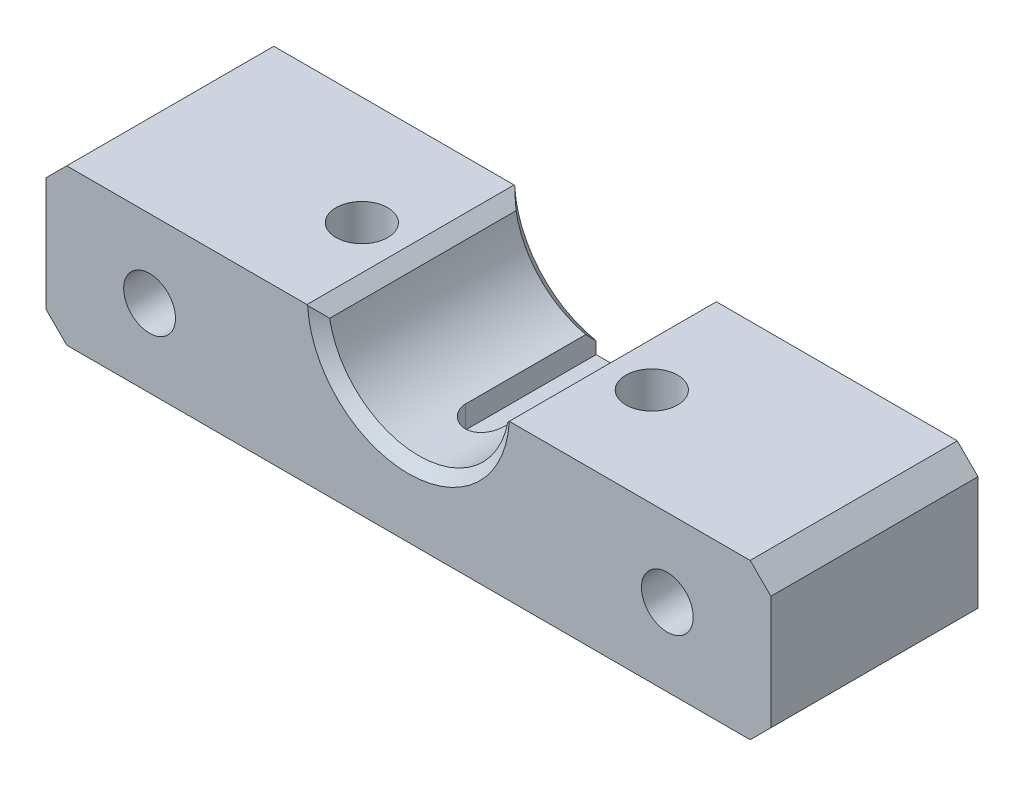
ISO-10303-21;
HEADER;
FILE_DESCRIPTION(('STEP AP214'),'2;1');
FILE_NAME('part.step','',(''),(''),'','','');
FILE_SCHEMA(('AUTOMOTIVE_DESIGN { 1 0 10303 214 1 1 1 1 }'));
ENDSEC;
DATA;
#1=APPLICATION_CONTEXT('core data for automotive mechanical design processes');
#2=APPLICATION_PROTOCOL_DEFINITION('international standard','automotive_design',2000,#1);
#3=PRODUCT_CONTEXT('',#1,'mechanical');
#4=PRODUCT('Part','Part','',(#3));
#5=PRODUCT_RELATED_PRODUCT_CATEGORY('part','',(#4));
#6=PRODUCT_DEFINITION_FORMATION('','',#4);
#7=PRODUCT_DEFINITION_CONTEXT('part definition',#1,'design');
#8=PRODUCT_DEFINITION('design','',#6,#7);
#9=PRODUCT_DEFINITION_SHAPE('','',#8);
#10=(LENGTH_UNIT() NAMED_UNIT(*) SI_UNIT(.MILLI.,.METRE.));
#11=(NAMED_UNIT(*) PLANE_ANGLE_UNIT() SI_UNIT($,.RADIAN.));
#12=(NAMED_UNIT(*) SI_UNIT($,.STERADIAN.) SOLID_ANGLE_UNIT());
#13=UNCERTAINTY_MEASURE_WITH_UNIT(LENGTH_MEASURE(1.E-05),#10,'distance_accuracy_value','');
#14=(GEOMETRIC_REPRESENTATION_CONTEXT(3) GLOBAL_UNCERTAINTY_ASSIGNED_CONTEXT((#13)) GLOBAL_UNIT_ASSIGNED_CONTEXT((#10,
#11,#12)) REPRESENTATION_CONTEXT('',''));
#15=CARTESIAN_POINT('',(0.,0.,0.));
#16=DIRECTION('',(0.,0.,1.));
#17=DIRECTION('',(1.,0.,0.));
#18=AXIS2_PLACEMENT_3D('',#15,#16,#17);
#19=CARTESIAN_POINT('',(0.,-19.685,34.925));
#20=DIRECTION('',(0.,-1.,0.));
#21=DIRECTION('',(1.,0.,0.));
#22=AXIS2_PLACEMENT_3D('',#19,#20,#21);
#23=PLANE('',#22);
#24=DIRECTION('',(-1.,0.,0.));
#25=VECTOR('',#24,1.);
#26=CARTESIAN_POINT('',(0.,-19.685,34.925));
#27=LINE('',#26,#25);
#28=CARTESIAN_POINT('',(41.91,-19.685,34.925));
#29=VERTEX_POINT('',#28);
#30=CARTESIAN_POINT('',(-41.91,-19.685,34.925));
#31=VERTEX_POINT('',#30);
#32=EDGE_CURVE('E207',#29,#31,#27,.T.);
#33=ORIENTED_EDGE('',*,*,#32,.T.);
#34=DIRECTION('',(0.,0.,-1.));
#35=VECTOR('',#34,1.);
#36=CARTESIAN_POINT('',(-41.91,-19.685,34.925));
#37=LINE('',#36,#35);
#38=CARTESIAN_POINT('',(-41.91,-19.685,9.525));
#39=VERTEX_POINT('',#38);
#40=EDGE_CURVE('E257',#31,#39,#37,.T.);
#41=ORIENTED_EDGE('',*,*,#40,.T.);
#42=DIRECTION('',(-1.,0.,0.));
#43=VECTOR('',#42,1.);
#44=CARTESIAN_POINT('',(0.,-19.685,9.525));
#45=LINE('',#44,#43);
#46=CARTESIAN_POINT('',(41.91,-19.685,9.525));
#47=VERTEX_POINT('',#46);
#48=EDGE_CURVE('E217',#47,#39,#45,.T.);
#49=ORIENTED_EDGE('',*,*,#48,.F.);
#50=DIRECTION('',(0.,0.,1.));
#51=VECTOR('',#50,1.);
#52=CARTESIAN_POINT('',(41.91,-19.685,34.925));
#53=LINE('',#52,#51);
#54=EDGE_CURVE('E255',#47,#29,#53,.T.);
#55=ORIENTED_EDGE('',*,*,#54,.T.);
#56=EDGE_LOOP('',(#33,#41,#49,#55));
#57=FACE_BOUND('',#56,.T.);
#58=CARTESIAN_POINT('',(17.78,-19.685,22.86));
#59=DIRECTION('',(0.,-1.,0.));
#60=DIRECTION('',(1.,0.,0.));
#61=AXIS2_PLACEMENT_3D('',#58,#59,#60);
#62=CIRCLE('',#61,3.17500000000003);
#63=CARTESIAN_POINT('',(20.955,-19.685,22.86));
#64=VERTEX_POINT('',#63);
#65=EDGE_CURVE('E219',#64,#64,#62,.T.);
#66=ORIENTED_EDGE('',*,*,#65,.F.);
#67=EDGE_LOOP('',(#66));
#68=FACE_BOUND('',#67,.T.);
#69=CARTESIAN_POINT('',(-17.78,-19.685,22.86));
#70=DIRECTION('',(0.,-1.,0.));
#71=DIRECTION('',(1.,0.,0.));
#72=AXIS2_PLACEMENT_3D('',#69,#70,#71);
#73=CIRCLE('',#72,3.17500000000003);
#74=CARTESIAN_POINT('',(-14.605,-19.685,22.86));
#75=VERTEX_POINT('',#74);
#76=EDGE_CURVE('E224',#75,#75,#73,.F.);
#77=ORIENTED_EDGE('',*,*,#76,.T.);
#78=EDGE_LOOP('',(#77));
#79=FACE_BOUND('',#78,.T.);
#80=ADVANCED_FACE('F43',(#57,#68,#79),#23,.T.);
#81=CARTESIAN_POINT('',(0.,0.,34.925));
#82=DIRECTION('',(0.,0.,1.));
#83=DIRECTION('',(1.,0.,0.));
#84=AXIS2_PLACEMENT_3D('',#81,#82,#83);
#85=PLANE('',#84);
#86=CARTESIAN_POINT('',(-31.75,-10.16,34.925));
#87=DIRECTION('',(0.,0.,1.));
#88=DIRECTION('',(1.,0.,0.));
#89=AXIS2_PLACEMENT_3D('',#86,#87,#88);
#90=CIRCLE('',#89,3.175);
#91=CARTESIAN_POINT('',(-28.575,-10.16,34.925));
#92=VERTEX_POINT('',#91);
#93=EDGE_CURVE('E449',#92,#92,#90,.T.);
#94=ORIENTED_EDGE('',*,*,#93,.F.);
#95=EDGE_LOOP('',(#94));
#96=FACE_BOUND('',#95,.T.);
#97=DIRECTION('',(-1.,0.,0.));
#98=VECTOR('',#97,1.);
#99=CARTESIAN_POINT('',(0.,-0.635000000000004,34.925));
#100=LINE('',#99,#98);
#101=CARTESIAN_POINT('',(41.91,-0.63499999999999,34.925));
#102=VERTEX_POINT('',#101);
#103=CARTESIAN_POINT('',(12.3662072297855,-0.635,34.925));
#104=VERTEX_POINT('',#103);
#105=EDGE_CURVE('E394',#102,#104,#100,.T.);
#106=ORIENTED_EDGE('',*,*,#105,.T.);
#107=CARTESIAN_POINT('',(0.,0.,34.925));
#108=DIRECTION('',(0.,0.,1.));
#109=DIRECTION('',(1.,0.,0.));
#110=AXIS2_PLACEMENT_3D('',#107,#108,#109);
#111=CIRCLE('',#110,12.3825);
#112=CARTESIAN_POINT('',(-12.3622671433467,-0.707571428571462,34.925));
#113=VERTEX_POINT('',#112);
#114=EDGE_CURVE('E405',#104,#113,#111,.F.);
#115=ORIENTED_EDGE('',*,*,#114,.T.);
#116=DIRECTION('',(0.746357478959566,-0.665545275395387,0.));
#117=VECTOR('',#116,1.);
#118=CARTESIAN_POINT('',(-5.82734785738763,-6.53491928595907,34.925));
#119=LINE('',#118,#117);
#120=CARTESIAN_POINT('',(-12.4436503797327,-0.635,34.925));
#121=VERTEX_POINT('',#120);
#122=EDGE_CURVE('E401',#113,#121,#119,.F.);
#123=ORIENTED_EDGE('',*,*,#122,.T.);
#124=DIRECTION('',(1.,0.,0.));
#125=VECTOR('',#124,1.);
#126=CARTESIAN_POINT('',(0.,-0.635,34.925));
#127=LINE('',#126,#125);
#128=CARTESIAN_POINT('',(-41.91,-0.635,34.925));
#129=VERTEX_POINT('',#128);
#130=EDGE_CURVE('E386',#129,#121,#127,.T.);
#131=ORIENTED_EDGE('',*,*,#130,.F.);
#132=DIRECTION('',(0.707106781186548,0.707106781186548,0.));
#133=VECTOR('',#132,1.);
#134=CARTESIAN_POINT('',(-20.6375,20.6375,34.925));
#135=LINE('',#134,#133);
#136=CARTESIAN_POINT('',(-44.45,-3.17500000000001,34.925));
#137=VERTEX_POINT('',#136);
#138=EDGE_CURVE('E244',#129,#137,#135,.F.);
#139=ORIENTED_EDGE('',*,*,#138,.T.);
#140=DIRECTION('',(0.,1.,0.));
#141=VECTOR('',#140,1.);
#142=CARTESIAN_POINT('',(-44.45,0.,34.925));
#143=LINE('',#142,#141);
#144=CARTESIAN_POINT('',(-44.45,-17.145,34.925));
#145=VERTEX_POINT('',#144);
#146=EDGE_CURVE('E213',#145,#137,#143,.T.);
#147=ORIENTED_EDGE('',*,*,#146,.F.);
#148=DIRECTION('',(-0.707106781186548,0.707106781186548,0.));
#149=VECTOR('',#148,1.);
#150=CARTESIAN_POINT('',(-30.7975,-30.7975,34.925));
#151=LINE('',#150,#149);
#152=EDGE_CURVE('E242',#145,#31,#151,.F.);
#153=ORIENTED_EDGE('',*,*,#152,.T.);
#154=ORIENTED_EDGE('',*,*,#32,.F.);
#155=DIRECTION('',(0.707106781186546,0.707106781186549,0.));
#156=VECTOR('',#155,1.);
#157=CARTESIAN_POINT('',(30.7975000000001,-30.7975,34.925));
#158=LINE('',#157,#156);
#159=CARTESIAN_POINT('',(44.45,-17.145,34.925));
#160=VERTEX_POINT('',#159);
#161=EDGE_CURVE('E240',#29,#160,#158,.T.);
#162=ORIENTED_EDGE('',*,*,#161,.T.);
#163=DIRECTION('',(0.,1.,0.));
#164=VECTOR('',#163,1.);
#165=CARTESIAN_POINT('',(44.45,0.,34.925));
#166=LINE('',#165,#164);
#167=CARTESIAN_POINT('',(44.45,-3.17499999999998,34.925));
#168=VERTEX_POINT('',#167);
#169=EDGE_CURVE('E454',#160,#168,#166,.T.);
#170=ORIENTED_EDGE('',*,*,#169,.T.);
#171=DIRECTION('',(0.707106781186548,-0.707106781186548,0.));
#172=VECTOR('',#171,1.);
#173=CARTESIAN_POINT('',(20.6375,20.6375,34.925));
#174=LINE('',#173,#172);
#175=EDGE_CURVE('E246',#168,#102,#174,.F.);
#176=ORIENTED_EDGE('',*,*,#175,.T.);
#177=EDGE_LOOP('',(#106,#115,#123,#131,#139,#147,#153,#154,#162,#170,#176));
#178=FACE_BOUND('',#177,.T.);
#179=CARTESIAN_POINT('',(31.75,-10.16,34.925));
#180=DIRECTION('',(0.,0.,1.));
#181=DIRECTION('',(1.,0.,0.));
#182=AXIS2_PLACEMENT_3D('',#179,#180,#181);
#183=CIRCLE('',#182,3.175);
#184=CARTESIAN_POINT('',(34.925,-10.16,34.925));
#185=VERTEX_POINT('',#184);
#186=EDGE_CURVE('E517',#185,#185,#183,.T.);
#187=ORIENTED_EDGE('',*,*,#186,.F.);
#188=EDGE_LOOP('',(#187));
#189=FACE_BOUND('',#188,.T.);
#190=ADVANCED_FACE('F362',(#96,#178,#189),#85,.T.);
#191=CARTESIAN_POINT('',(0.,0.,9.525));
#192=DIRECTION('',(0.,0.,1.));
#193=DIRECTION('',(1.,0.,0.));
#194=AXIS2_PLACEMENT_3D('',#191,#192,#193);
#195=PLANE('',#194);
#196=DIRECTION('',(0.,1.,0.));
#197=VECTOR('',#196,1.);
#198=CARTESIAN_POINT('',(2.38125,0.,9.525));
#199=LINE('',#198,#197);
#200=CARTESIAN_POINT('',(2.38125000000001,-13.62075,9.525));
#201=VERTEX_POINT('',#200);
#202=CARTESIAN_POINT('',(2.38125000000001,-12.1513766581198,9.525));
#203=VERTEX_POINT('',#202);
#204=EDGE_CURVE('E192',#201,#203,#199,.T.);
#205=ORIENTED_EDGE('',*,*,#204,.T.);
#206=CARTESIAN_POINT('',(0.,0.,9.525));
#207=DIRECTION('',(0.,0.,1.));
#208=DIRECTION('',(1.,0.,0.));
#209=AXIS2_PLACEMENT_3D('',#206,#207,#208);
#210=CIRCLE('',#209,12.3825);
#211=CARTESIAN_POINT('',(12.3662072297855,-0.635,9.525));
#212=VERTEX_POINT('',#211);
#213=EDGE_CURVE('E264',#203,#212,#210,.T.);
#214=ORIENTED_EDGE('',*,*,#213,.T.);
#215=DIRECTION('',(-1.,0.,0.));
#216=VECTOR('',#215,1.);
#217=CARTESIAN_POINT('',(0.,-0.635000000000004,9.525));
#218=LINE('',#217,#216);
#219=CARTESIAN_POINT('',(41.91,-0.63499999999999,9.525));
#220=VERTEX_POINT('',#219);
#221=EDGE_CURVE('E439',#220,#212,#218,.T.);
#222=ORIENTED_EDGE('',*,*,#221,.F.);
#223=DIRECTION('',(-0.707106781186548,0.707106781186548,0.));
#224=VECTOR('',#223,1.);
#225=CARTESIAN_POINT('',(41.91,-0.63499999999999,9.525));
#226=LINE('',#225,#224);
#227=CARTESIAN_POINT('',(44.45,-3.17499999999998,9.525));
#228=VERTEX_POINT('',#227);
#229=EDGE_CURVE('E233',#220,#228,#226,.F.);
#230=ORIENTED_EDGE('',*,*,#229,.T.);
#231=DIRECTION('',(0.,1.,0.));
#232=VECTOR('',#231,1.);
#233=CARTESIAN_POINT('',(44.45,0.,9.525));
#234=LINE('',#233,#232);
#235=CARTESIAN_POINT('',(44.45,-17.145,9.525));
#236=VERTEX_POINT('',#235);
#237=EDGE_CURVE('E444',#236,#228,#234,.T.);
#238=ORIENTED_EDGE('',*,*,#237,.F.);
#239=DIRECTION('',(-0.707106781186546,-0.707106781186549,0.));
#240=VECTOR('',#239,1.);
#241=CARTESIAN_POINT('',(44.45,-17.145,9.525));
#242=LINE('',#241,#240);
#243=EDGE_CURVE('E210',#236,#47,#242,.T.);
#244=ORIENTED_EDGE('',*,*,#243,.T.);
#245=ORIENTED_EDGE('',*,*,#48,.T.);
#246=DIRECTION('',(0.707106781186548,-0.707106781186548,0.));
#247=VECTOR('',#246,1.);
#248=CARTESIAN_POINT('',(-41.91,-19.685,9.525));
#249=LINE('',#248,#247);
#250=CARTESIAN_POINT('',(-44.45,-17.145,9.525));
#251=VERTEX_POINT('',#250);
#252=EDGE_CURVE('E229',#39,#251,#249,.F.);
#253=ORIENTED_EDGE('',*,*,#252,.T.);
#254=DIRECTION('',(0.,1.,0.));
#255=VECTOR('',#254,1.);
#256=CARTESIAN_POINT('',(-44.45,0.,9.525));
#257=LINE('',#256,#255);
#258=CARTESIAN_POINT('',(-44.45,-3.17500000000001,9.525));
#259=VERTEX_POINT('',#258);
#260=EDGE_CURVE('E446',#251,#259,#257,.T.);
#261=ORIENTED_EDGE('',*,*,#260,.T.);
#262=DIRECTION('',(-0.707106781186548,-0.707106781186548,0.));
#263=VECTOR('',#262,1.);
#264=CARTESIAN_POINT('',(-44.45,-3.17500000000001,9.525));
#265=LINE('',#264,#263);
#266=CARTESIAN_POINT('',(-41.91,-0.635,9.525));
#267=VERTEX_POINT('',#266);
#268=EDGE_CURVE('E231',#259,#267,#265,.F.);
#269=ORIENTED_EDGE('',*,*,#268,.T.);
#270=DIRECTION('',(1.,0.,0.));
#271=VECTOR('',#270,1.);
#272=CARTESIAN_POINT('',(0.,-0.635,9.525));
#273=LINE('',#272,#271);
#274=CARTESIAN_POINT('',(-12.4436503797327,-0.635,9.525));
#275=VERTEX_POINT('',#274);
#276=EDGE_CURVE('E443',#267,#275,#273,.T.);
#277=ORIENTED_EDGE('',*,*,#276,.T.);
#278=DIRECTION('',(-0.746357478959566,0.665545275395387,0.));
#279=VECTOR('',#278,1.);
#280=CARTESIAN_POINT('',(-12.4436503797327,-0.635,9.525));
#281=LINE('',#280,#279);
#282=CARTESIAN_POINT('',(-12.3622671433467,-0.707571428571475,9.525));
#283=VERTEX_POINT('',#282);
#284=EDGE_CURVE('E260',#275,#283,#281,.F.);
#285=ORIENTED_EDGE('',*,*,#284,.T.);
#286=CARTESIAN_POINT('',(0.,0.,9.525));
#287=DIRECTION('',(0.,0.,1.));
#288=DIRECTION('',(1.,0.,0.));
#289=AXIS2_PLACEMENT_3D('',#286,#287,#288);
#290=CIRCLE('',#289,12.3825);
#291=CARTESIAN_POINT('',(-2.38124999999999,-12.1513766581198,9.525));
#292=VERTEX_POINT('',#291);
#293=EDGE_CURVE('E262',#283,#292,#290,.T.);
#294=ORIENTED_EDGE('',*,*,#293,.T.);
#295=DIRECTION('',(0.,-1.,0.));
#296=VECTOR('',#295,1.);
#297=CARTESIAN_POINT('',(-2.38125000000001,0.,9.525));
#298=LINE('',#297,#296);
#299=CARTESIAN_POINT('',(-2.38124999999999,-13.62075,9.525));
#300=VERTEX_POINT('',#299);
#301=EDGE_CURVE('E199',#292,#300,#298,.T.);
#302=ORIENTED_EDGE('',*,*,#301,.T.);
#303=DIRECTION('',(1.,0.,0.));
#304=VECTOR('',#303,1.);
#305=CARTESIAN_POINT('',(0.,-13.62075,9.525));
#306=LINE('',#305,#304);
#307=EDGE_CURVE('E182',#300,#201,#306,.T.);
#308=ORIENTED_EDGE('',*,*,#307,.T.);
#309=EDGE_LOOP('',(#205,#214,#222,#230,#238,#244,#245,#253,#261,#269,#277,#285,#294,#302,#308));
#310=FACE_BOUND('',#309,.T.);
#311=CARTESIAN_POINT('',(-31.75,-10.16,9.525));
#312=DIRECTION('',(0.,0.,1.));
#313=DIRECTION('',(1.,0.,0.));
#314=AXIS2_PLACEMENT_3D('',#311,#312,#313);
#315=CIRCLE('',#314,3.175);
#316=CARTESIAN_POINT('',(-28.575,-10.16,9.525));
#317=VERTEX_POINT('',#316);
#318=EDGE_CURVE('E463',#317,#317,#315,.T.);
#319=ORIENTED_EDGE('',*,*,#318,.T.);
#320=EDGE_LOOP('',(#319));
#321=FACE_BOUND('',#320,.T.);
#322=CARTESIAN_POINT('',(31.75,-10.16,9.525));
#323=DIRECTION('',(0.,0.,1.));
#324=DIRECTION('',(1.,0.,0.));
#325=AXIS2_PLACEMENT_3D('',#322,#323,#324);
#326=CIRCLE('',#325,3.175);
#327=CARTESIAN_POINT('',(34.925,-10.16,9.525));
#328=VERTEX_POINT('',#327);
#329=EDGE_CURVE('E516',#328,#328,#326,.T.);
#330=ORIENTED_EDGE('',*,*,#329,.T.);
#331=EDGE_LOOP('',(#330));
#332=FACE_BOUND('',#331,.T.);
#333=ADVANCED_FACE('F203',(#310,#321,#332),#195,.F.);
#334=CARTESIAN_POINT('',(44.45,0.,34.925));
#335=DIRECTION('',(-1.,0.,0.));
#336=DIRECTION('',(0.,0.,1.));
#337=AXIS2_PLACEMENT_3D('',#334,#335,#336);
#338=PLANE('',#337);
#339=ORIENTED_EDGE('',*,*,#237,.T.);
#340=DIRECTION('',(0.,0.,1.));
#341=VECTOR('',#340,1.);
#342=CARTESIAN_POINT('',(44.45,-3.17499999999998,34.925));
#343=LINE('',#342,#341);
#344=EDGE_CURVE('E238',#228,#168,#343,.T.);
#345=ORIENTED_EDGE('',*,*,#344,.T.);
#346=ORIENTED_EDGE('',*,*,#169,.F.);
#347=DIRECTION('',(0.,0.,-1.));
#348=VECTOR('',#347,1.);
#349=CARTESIAN_POINT('',(44.45,-17.145,9.525));
#350=LINE('',#349,#348);
#351=EDGE_CURVE('E235',#160,#236,#350,.T.);
#352=ORIENTED_EDGE('',*,*,#351,.T.);
#353=EDGE_LOOP('',(#339,#345,#346,#352));
#354=FACE_BOUND('',#353,.T.);
#355=ADVANCED_FACE('F287',(#354),#338,.F.);
#356=CARTESIAN_POINT('',(0.,-0.635000000000004,34.925));
#357=DIRECTION('',(0.,-1.,0.));
#358=DIRECTION('',(1.,0.,0.));
#359=AXIS2_PLACEMENT_3D('',#356,#357,#358);
#360=PLANE('',#359);
#361=CARTESIAN_POINT('',(17.78,-0.634999999999997,22.86));
#362=DIRECTION('',(0.,-1.,0.));
#363=DIRECTION('',(1.,0.,0.));
#364=AXIS2_PLACEMENT_3D('',#361,#362,#363);
#365=CIRCLE('',#364,3.17500000000003);
#366=CARTESIAN_POINT('',(20.955,-0.634999999999996,22.86));
#367=VERTEX_POINT('',#366);
#368=EDGE_CURVE('E222',#367,#367,#365,.T.);
#369=ORIENTED_EDGE('',*,*,#368,.T.);
#370=EDGE_LOOP('',(#369));
#371=FACE_BOUND('',#370,.T.);
#372=ORIENTED_EDGE('',*,*,#221,.T.);
#373=CARTESIAN_POINT('',(12.3662072297855,-0.635,9.525));
#374=CARTESIAN_POINT('',(12.3658964095099,-0.635,9.52531041123985));
#375=CARTESIAN_POINT('',(12.3655855892342,-0.635,9.5256208224797));
#376=CARTESIAN_POINT('',(12.364963948683,-0.635,9.5262416449594));
#377=CARTESIAN_POINT('',(12.3646531284073,-0.635,9.52655205619925));
#378=CARTESIAN_POINT('',(12.3643423081317,-0.635,9.5268624674391));
#379=B_SPLINE_CURVE_WITH_KNOTS('',3,(#373,#374,#375,#376,#377,#378),.UNSPECIFIED.,.F.,.F.,(4,2,
4),(0.,0.00131783133752065,0.00263566267504375),.UNSPECIFIED.);
#380=CARTESIAN_POINT('',(12.3643423081317,-0.635,9.5268624674391));
#381=VERTEX_POINT('',#380);
#382=EDGE_CURVE('E293',#212,#381,#379,.T.);
#383=ORIENTED_EDGE('',*,*,#382,.T.);
#384=DIRECTION('',(0.,0.,1.));
#385=VECTOR('',#384,1.);
#386=CARTESIAN_POINT('',(12.3643423081317,-0.635,34.925));
#387=LINE('',#386,#385);
#388=CARTESIAN_POINT('',(12.3643423081317,-0.635,34.9231375325609));
#389=VERTEX_POINT('',#388);
#390=EDGE_CURVE('E274',#381,#389,#387,.T.);
#391=ORIENTED_EDGE('',*,*,#390,.T.);
#392=CARTESIAN_POINT('',(12.3643423081317,-0.635,34.9231375325609));
#393=CARTESIAN_POINT('',(12.3646531284073,-0.635,34.9234479438008));
#394=CARTESIAN_POINT('',(12.364963948683,-0.635,34.9237583550406));
#395=CARTESIAN_POINT('',(12.3655855892342,-0.635,34.9243791775203));
#396=CARTESIAN_POINT('',(12.3658964095099,-0.635,34.9246895887601));
#397=CARTESIAN_POINT('',(12.3662072297855,-0.635,34.925));
#398=B_SPLINE_CURVE_WITH_KNOTS('',3,(#392,#393,#394,#395,#396,#397),.UNSPECIFIED.,.F.,.F.,(4,2,
4),(0.,0.00131783133752065,0.00263566267504498),.UNSPECIFIED.);
#399=EDGE_CURVE('E266',#389,#104,#398,.T.);
#400=ORIENTED_EDGE('',*,*,#399,.T.);
#401=ORIENTED_EDGE('',*,*,#105,.F.);
#402=DIRECTION('',(0.,0.,-1.));
#403=VECTOR('',#402,1.);
#404=CARTESIAN_POINT('',(41.91,-0.63499999999999,34.925));
#405=LINE('',#404,#403);
#406=EDGE_CURVE('E206',#102,#220,#405,.T.);
#407=ORIENTED_EDGE('',*,*,#406,.T.);
#408=EDGE_LOOP('',(#372,#383,#391,#400,#401,#407));
#409=FACE_BOUND('',#408,.T.);
#410=ADVANCED_FACE('F281',(#371,#409),#360,.F.);
#411=CARTESIAN_POINT('',(0.,0.,34.925));
#412=DIRECTION('',(0.,0.,-1.));
#413=DIRECTION('',(-1.,0.,0.));
#414=AXIS2_PLACEMENT_3D('',#411,#412,#413);
#415=CYLINDRICAL_SURFACE('',#414,11.1125);
#416=DIRECTION('',(0.,0.,-1.));
#417=VECTOR('',#416,1.);
#418=CARTESIAN_POINT('',(10.915336790638,-2.08400551749367,34.925));
#419=LINE('',#418,#417);
#420=CARTESIAN_POINT('',(10.915336790638,-2.08400551749367,33.655));
#421=VERTEX_POINT('',#420);
#422=CARTESIAN_POINT('',(10.915336790638,-2.08400551749367,10.795));
#423=VERTEX_POINT('',#422);
#424=EDGE_CURVE('E418',#421,#423,#419,.T.);
#425=ORIENTED_EDGE('',*,*,#424,.T.);
#426=CARTESIAN_POINT('',(0.,0.,10.795));
#427=DIRECTION('',(0.,0.,1.));
#428=DIRECTION('',(1.,0.,0.));
#429=AXIS2_PLACEMENT_3D('',#426,#427,#428);
#430=CIRCLE('',#429,11.1125);
#431=CARTESIAN_POINT('',(2.38125000000001,-10.854368000372,10.795));
#432=VERTEX_POINT('',#431);
#433=EDGE_CURVE('E332',#423,#432,#430,.F.);
#434=ORIENTED_EDGE('',*,*,#433,.T.);
#435=DIRECTION('',(0.,0.,-1.));
#436=VECTOR('',#435,1.);
#437=CARTESIAN_POINT('',(2.38125000000001,-10.854368000372,27.94));
#438=LINE('',#437,#436);
#439=CARTESIAN_POINT('',(2.38125000000001,-10.854368000372,25.55875));
#440=VERTEX_POINT('',#439);
#441=EDGE_CURVE('E189',#440,#432,#438,.T.);
#442=ORIENTED_EDGE('',*,*,#441,.F.);
#443=CARTESIAN_POINT('',(2.38125000000001,-10.854368000372,25.55875));
#444=CARTESIAN_POINT('',(2.38125731029288,-10.8543618083452,25.6249052313647));
#445=CARTESIAN_POINT('',(2.37849323153026,-10.8549726686914,25.6910563472308));
#446=CARTESIAN_POINT('',(2.36747901541211,-10.8573826259014,25.8228697918288));
#447=CARTESIAN_POINT('',(2.35922962083524,-10.8591815618851,25.8885321855226));
#448=CARTESIAN_POINT('',(2.33732011782288,-10.8639177928308,26.0187948927667));
#449=CARTESIAN_POINT('',(2.32366923874024,-10.8668531458479,26.0833968232145));
#450=CARTESIAN_POINT('',(2.29107920168039,-10.8737706224298,26.2111771259139));
#451=CARTESIAN_POINT('',(2.27214000918637,-10.8777527528269,26.274355488871));
#452=CARTESIAN_POINT('',(2.20758248764443,-10.8911062462534,26.4611021472623));
#453=CARTESIAN_POINT('',(2.15420588034613,-10.9018889280778,26.5819901362515));
#454=CARTESIAN_POINT('',(2.02840006084028,-10.925993070211,26.8130554289752));
#455=CARTESIAN_POINT('',(1.95596751960317,-10.9393149740041,26.9232308566384));
#456=CARTESIAN_POINT('',(1.79285162985098,-10.9672361222124,27.1315747945938));
#457=CARTESIAN_POINT('',(1.70192046579961,-10.981850999203,27.2295475372086));
#458=CARTESIAN_POINT('',(1.50491233133205,-11.0105760705079,27.4089792537758));
#459=CARTESIAN_POINT('',(1.3988325071393,-11.0246861691019,27.4904351091858));
#460=CARTESIAN_POINT('',(1.17320626983486,-11.0509846611919,27.6353094828378));
#461=CARTESIAN_POINT('',(1.05353213465334,-11.0631517111739,27.6985331024775));
#462=CARTESIAN_POINT('',(0.804983142692555,-11.0840049029696,27.8038645305007));
#463=CARTESIAN_POINT('',(0.676114986037952,-11.0926935497425,27.8459875399225));
#464=CARTESIAN_POINT('',(0.455440706182709,-11.1035222770726,27.8978361618829));
#465=CARTESIAN_POINT('',(0.365072497846721,-11.1068703359535,27.9136274358391));
#466=CARTESIAN_POINT('',(0.183151109667501,-11.1113671214621,27.9347136203815));
#467=CARTESIAN_POINT('',(0.0915990929806456,-11.1125178629516,27.9400181470998));
#468=CARTESIAN_POINT('',(0.,-11.1125,27.94));
#469=B_SPLINE_CURVE_WITH_KNOTS('',3,(#443,#444,#445,#446,#447,#448,#449,#450,#451,#452,#453,
#454,#455,#456,#457,#458,#459,#460,#461,#462,#463,#464,#465,#466,#467,#468),.UNSPECIFIED.,.F.,
.F.,(4,2,2,2,2,2,2,2,2,2,2,2,4),(0.,0.198397990447355,0.396769120856834,0.594802754141476,
0.792837680021285,1.18858242799952,1.58439635767228,1.98591058393143,2.38750054937456,
2.79323651257426,3.19867975865139,3.47347920358404,3.74802654596497),.UNSPECIFIED.);
#470=CARTESIAN_POINT('',(0.,-11.1125,27.94));
#471=VERTEX_POINT('',#470);
#472=EDGE_CURVE('E53',#440,#471,#469,.T.);
#473=ORIENTED_EDGE('',*,*,#472,.T.);
#474=CARTESIAN_POINT('',(0.,-11.1125,27.94));
#475=CARTESIAN_POINT('',(-0.0661728880134317,-11.1125056554506,27.9400072682973));
#476=CARTESIAN_POINT('',(-0.132341759246078,-11.1119090536825,27.93724175568));
#477=CARTESIAN_POINT('',(-0.264191716651261,-11.1095532341843,27.9262215242901));
#478=CARTESIAN_POINT('',(-0.329872864415999,-11.1077941658712,27.9179675109775));
#479=CARTESIAN_POINT('',(-0.460176626707505,-11.1031591421649,27.8960448187712));
#480=CARTESIAN_POINT('',(-0.5248008174679,-11.1002850457309,27.8823851513519));
#481=CARTESIAN_POINT('',(-0.652625928579859,-11.0935044292074,27.8497732875526));
#482=CARTESIAN_POINT('',(-0.715826842049215,-11.0895979041269,27.8308210655865));
#483=CARTESIAN_POINT('',(-0.902644527893435,-11.0764797715718,27.7662162707137));
#484=CARTESIAN_POINT('',(-1.0235802365462,-11.0658656580903,27.7127979321786));
#485=CARTESIAN_POINT('',(-1.25472444720257,-11.0420504079918,27.586894558325));
#486=CARTESIAN_POINT('',(-1.36493128544992,-11.0288488710893,27.5144065722546));
#487=CARTESIAN_POINT('',(-1.57324011798414,-11.0010802236588,27.3512340312176));
#488=CARTESIAN_POINT('',(-1.67115593698971,-10.9864969055312,27.2603141592566));
#489=CARTESIAN_POINT('',(-1.85047776136351,-10.9577214929547,27.0633521412499));
#490=CARTESIAN_POINT('',(-1.93188036791156,-10.9435294795642,26.9573068896677));
#491=CARTESIAN_POINT('',(-2.07669740458774,-10.9169812706528,26.7317126244294));
#492=CARTESIAN_POINT('',(-2.13990758076635,-10.9046466101441,26.6120298628955));
#493=CARTESIAN_POINT('',(-2.24521116475204,-10.8834546967296,26.3634636452676));
#494=CARTESIAN_POINT('',(-2.28732017618359,-10.8745948753502,26.2345870685029));
#495=CARTESIAN_POINT('',(-2.33913067634615,-10.8635438947306,26.0139510634761));
#496=CARTESIAN_POINT('',(-2.35490483814162,-10.8601234147068,25.9236327671063));
#497=CARTESIAN_POINT('',(-2.37596897696094,-10.855526658365,25.7418080772608));
#498=CARTESIAN_POINT('',(-2.38126823890859,-10.8543483945869,25.6503028084112));
#499=CARTESIAN_POINT('',(-2.38124999999999,-10.854368000372,25.55875));
#500=B_SPLINE_CURVE_WITH_KNOTS('',3,(#474,#475,#476,#477,#478,#479,#480,#481,#482,#483,#484,
#485,#486,#487,#488,#489,#490,#491,#492,#493,#494,#495,#496,#497,#498,#499),.UNSPECIFIED.,.F.,
.F.,(4,2,2,2,2,2,2,2,2,2,2,2,4),(0.,0.198451202985719,0.396876903129208,0.594973202581335,
0.793070459715743,1.18895230918271,1.58489545170305,1.98625396103871,2.38769499607342,
2.79348149070545,3.1989674749952,3.47361866297639,3.74802629149828),.UNSPECIFIED.);
#501=CARTESIAN_POINT('',(-2.38124999999999,-10.854368000372,25.55875));
#502=VERTEX_POINT('',#501);
#503=EDGE_CURVE('E11',#471,#502,#500,.T.);
#504=ORIENTED_EDGE('',*,*,#503,.T.);
#505=DIRECTION('',(0.,0.,-1.));
#506=VECTOR('',#505,1.);
#507=CARTESIAN_POINT('',(-2.38124999999999,-10.854368000372,27.94));
#508=LINE('',#507,#506);
#509=CARTESIAN_POINT('',(-2.38124999999999,-10.854368000372,10.795));
#510=VERTEX_POINT('',#509);
#511=EDGE_CURVE('E200',#502,#510,#508,.T.);
#512=ORIENTED_EDGE('',*,*,#511,.T.);
#513=CARTESIAN_POINT('',(0.,0.,10.795));
#514=DIRECTION('',(0.,0.,1.));
#515=DIRECTION('',(1.,0.,0.));
#516=AXIS2_PLACEMENT_3D('',#513,#514,#515);
#517=CIRCLE('',#516,11.1125);
#518=CARTESIAN_POINT('',(-10.9345550606117,-1.98069732075622,10.795));
#519=VERTEX_POINT('',#518);
#520=EDGE_CURVE('E415',#510,#519,#517,.F.);
#521=ORIENTED_EDGE('',*,*,#520,.T.);
#522=DIRECTION('',(0.,0.,-1.));
#523=VECTOR('',#522,1.);
#524=CARTESIAN_POINT('',(-10.9345550606117,-1.98069732075622,34.925));
#525=LINE('',#524,#523);
#526=CARTESIAN_POINT('',(-10.9345550606117,-1.98069732075622,33.655));
#527=VERTEX_POINT('',#526);
#528=EDGE_CURVE('E299',#519,#527,#525,.F.);
#529=ORIENTED_EDGE('',*,*,#528,.T.);
#530=CARTESIAN_POINT('',(0.,0.,33.655));
#531=DIRECTION('',(0.,0.,1.));
#532=DIRECTION('',(1.,0.,0.));
#533=AXIS2_PLACEMENT_3D('',#530,#531,#532);
#534=CIRCLE('',#533,11.1125);
#535=EDGE_CURVE('E420',#527,#421,#534,.T.);
#536=ORIENTED_EDGE('',*,*,#535,.T.);
#537=EDGE_LOOP('',(#425,#434,#442,#473,#504,#512,#521,#529,#536));
#538=FACE_BOUND('',#537,.T.);
#539=ADVANCED_FACE('F286',(#538),#415,.F.);
#540=CARTESIAN_POINT('',(0.,-0.635,34.925));
#541=DIRECTION('',(0.,1.,0.));
#542=DIRECTION('',(0.,0.,1.));
#543=AXIS2_PLACEMENT_3D('',#540,#541,#542);
#544=PLANE('',#543);
#545=CARTESIAN_POINT('',(-17.78,-0.634999999999997,22.86));
#546=DIRECTION('',(0.,1.,0.));
#547=DIRECTION('',(0.,0.,1.));
#548=AXIS2_PLACEMENT_3D('',#545,#546,#547);
#549=CIRCLE('',#548,3.17500000000003);
#550=CARTESIAN_POINT('',(-17.78,-0.634999999999997,26.035));
#551=VERTEX_POINT('',#550);
#552=EDGE_CURVE('E226',#551,#551,#549,.F.);
#553=ORIENTED_EDGE('',*,*,#552,.T.);
#554=EDGE_LOOP('',(#553));
#555=FACE_BOUND('',#554,.T.);
#556=ORIENTED_EDGE('',*,*,#130,.T.);
#557=DIRECTION('',(0.,0.,-1.));
#558=VECTOR('',#557,1.);
#559=CARTESIAN_POINT('',(-12.4436503797327,-0.635,34.925));
#560=LINE('',#559,#558);
#561=EDGE_CURVE('E389',#121,#275,#560,.T.);
#562=ORIENTED_EDGE('',*,*,#561,.T.);
#563=ORIENTED_EDGE('',*,*,#276,.F.);
#564=DIRECTION('',(0.,0.,1.));
#565=VECTOR('',#564,1.);
#566=CARTESIAN_POINT('',(-41.91,-0.635,34.925));
#567=LINE('',#566,#565);
#568=EDGE_CURVE('E253',#267,#129,#567,.T.);
#569=ORIENTED_EDGE('',*,*,#568,.T.);
#570=EDGE_LOOP('',(#556,#562,#563,#569));
#571=FACE_BOUND('',#570,.T.);
#572=ADVANCED_FACE('F360',(#555,#571),#544,.T.);
#573=CARTESIAN_POINT('',(-31.75,-10.16,34.925));
#574=DIRECTION('',(0.,0.,-1.));
#575=DIRECTION('',(-1.,0.,0.));
#576=AXIS2_PLACEMENT_3D('',#573,#574,#575);
#577=CYLINDRICAL_SURFACE('',#576,3.175);
#578=ORIENTED_EDGE('',*,*,#93,.T.);
#579=EDGE_LOOP('',(#578));
#580=FACE_BOUND('',#579,.T.);
#581=ORIENTED_EDGE('',*,*,#318,.F.);
#582=EDGE_LOOP('',(#581));
#583=FACE_BOUND('',#582,.T.);
#584=ADVANCED_FACE('F356',(#580,#583),#577,.F.);
#585=CARTESIAN_POINT('',(31.75,-10.16,34.925));
#586=DIRECTION('',(0.,0.,-1.));
#587=DIRECTION('',(-1.,0.,0.));
#588=AXIS2_PLACEMENT_3D('',#585,#586,#587);
#589=CYLINDRICAL_SURFACE('',#588,3.175);
#590=ORIENTED_EDGE('',*,*,#186,.T.);
#591=EDGE_LOOP('',(#590));
#592=FACE_BOUND('',#591,.T.);
#593=ORIENTED_EDGE('',*,*,#329,.F.);
#594=EDGE_LOOP('',(#593));
#595=FACE_BOUND('',#594,.T.);
#596=ADVANCED_FACE('F349',(#592,#595),#589,.F.);
#597=CARTESIAN_POINT('',(0.,-13.62075,27.94));
#598=DIRECTION('',(0.,-1.,0.));
#599=DIRECTION('',(0.,0.,-1.));
#600=AXIS2_PLACEMENT_3D('',#597,#598,#599);
#601=PLANE('',#600);
#602=CARTESIAN_POINT('',(0.,-13.62075,25.55875));
#603=DIRECTION('',(0.,-1.,0.));
#604=DIRECTION('',(0.,0.,-1.));
#605=AXIS2_PLACEMENT_3D('',#602,#603,#604);
#606=CIRCLE('',#605,2.38125);
#607=CARTESIAN_POINT('',(-2.38124999999999,-13.62075,25.55875));
#608=VERTEX_POINT('',#607);
#609=CARTESIAN_POINT('',(0.,-13.62075,27.94));
#610=VERTEX_POINT('',#609);
#611=EDGE_CURVE('E404',#608,#610,#606,.F.);
#612=ORIENTED_EDGE('',*,*,#611,.T.);
#613=CARTESIAN_POINT('',(0.,-13.62075,25.55875));
#614=DIRECTION('',(0.,-1.,0.));
#615=DIRECTION('',(0.,0.,-1.));
#616=AXIS2_PLACEMENT_3D('',#613,#614,#615);
#617=CIRCLE('',#616,2.38125);
#618=CARTESIAN_POINT('',(2.38125000000001,-13.62075,25.55875));
#619=VERTEX_POINT('',#618);
#620=EDGE_CURVE('E184',#610,#619,#617,.F.);
#621=ORIENTED_EDGE('',*,*,#620,.T.);
#622=DIRECTION('',(0.,0.,-1.));
#623=VECTOR('',#622,1.);
#624=CARTESIAN_POINT('',(2.38125000000001,-13.62075,27.94));
#625=LINE('',#624,#623);
#626=EDGE_CURVE('E177',#619,#201,#625,.T.);
#627=ORIENTED_EDGE('',*,*,#626,.T.);
#628=ORIENTED_EDGE('',*,*,#307,.F.);
#629=DIRECTION('',(0.,0.,-1.));
#630=VECTOR('',#629,1.);
#631=CARTESIAN_POINT('',(-2.38124999999999,-13.62075,27.94));
#632=LINE('',#631,#630);
#633=EDGE_CURVE('E188',#608,#300,#632,.T.);
#634=ORIENTED_EDGE('',*,*,#633,.F.);
#635=EDGE_LOOP('',(#612,#621,#627,#628,#634));
#636=FACE_BOUND('',#635,.T.);
#637=ADVANCED_FACE('F179',(#636),#601,.F.);
#638=CARTESIAN_POINT('',(-2.38125000000001,0.,27.94));
#639=DIRECTION('',(-1.,0.,0.));
#640=DIRECTION('',(0.,-1.,0.));
#641=AXIS2_PLACEMENT_3D('',#638,#639,#640);
#642=PLANE('',#641);
#643=ORIENTED_EDGE('',*,*,#511,.F.);
#644=DIRECTION('',(0.,1.,0.));
#645=VECTOR('',#644,1.);
#646=CARTESIAN_POINT('',(-2.38124999999999,-13.62075,25.55875));
#647=LINE('',#646,#645);
#648=EDGE_CURVE('E502',#502,#608,#647,.F.);
#649=ORIENTED_EDGE('',*,*,#648,.T.);
#650=ORIENTED_EDGE('',*,*,#633,.T.);
#651=ORIENTED_EDGE('',*,*,#301,.F.);
#652=CARTESIAN_POINT('',(-2.38124999999999,-12.1513766581198,9.525));
#653=CARTESIAN_POINT('',(-2.38124999999999,-11.9354544067113,9.73691774558149));
#654=CARTESIAN_POINT('',(-2.38124999999999,-11.7194092281676,9.94870994977825));
#655=CARTESIAN_POINT('',(-2.38124999999999,-11.2870730089273,10.3720432831207));
#656=CARTESIAN_POINT('',(-2.38124999999999,-11.0707819682218,10.5835844122573));
#657=CARTESIAN_POINT('',(-2.38124999999999,-10.854368000372,10.795));
#658=B_SPLINE_CURVE_WITH_KNOTS('',3,(#652,#653,#654,#655,#656,#657),.UNSPECIFIED.,.F.,.F.,(4,2,
4),(0.,0.907624984437093,1.81525000197072),.UNSPECIFIED.);
#659=EDGE_CURVE('E331',#292,#510,#658,.T.);
#660=ORIENTED_EDGE('',*,*,#659,.T.);
#661=EDGE_LOOP('',(#643,#649,#650,#651,#660));
#662=FACE_BOUND('',#661,.T.);
#663=ADVANCED_FACE('F346',(#662),#642,.F.);
#664=CARTESIAN_POINT('',(2.38125,0.,27.94));
#665=DIRECTION('',(1.,0.,0.));
#666=DIRECTION('',(0.,1.,0.));
#667=AXIS2_PLACEMENT_3D('',#664,#665,#666);
#668=PLANE('',#667);
#669=ORIENTED_EDGE('',*,*,#626,.F.);
#670=DIRECTION('',(0.,-1.,0.));
#671=VECTOR('',#670,1.);
#672=CARTESIAN_POINT('',(2.38125000000001,-10.854368000372,25.55875));
#673=LINE('',#672,#671);
#674=EDGE_CURVE('E508',#619,#440,#673,.F.);
#675=ORIENTED_EDGE('',*,*,#674,.T.);
#676=ORIENTED_EDGE('',*,*,#441,.T.);
#677=CARTESIAN_POINT('',(2.38125000000001,-10.854368000372,10.795));
#678=CARTESIAN_POINT('',(2.38125000000001,-11.0707819682218,10.5835844122573));
#679=CARTESIAN_POINT('',(2.38125000000001,-11.2870730089273,10.3720432831207));
#680=CARTESIAN_POINT('',(2.38125000000001,-11.7194092281676,9.94870994977825));
#681=CARTESIAN_POINT('',(2.38125000000001,-11.9354544067113,9.73691774558149));
#682=CARTESIAN_POINT('',(2.38125000000001,-12.1513766581198,9.525));
#683=B_SPLINE_CURVE_WITH_KNOTS('',3,(#677,#678,#679,#680,#681,#682),.UNSPECIFIED.,.F.,.F.,(4,2,
4),(0.,0.907625017533631,1.81525000197073),.UNSPECIFIED.);
#684=EDGE_CURVE('E195',#432,#203,#683,.T.);
#685=ORIENTED_EDGE('',*,*,#684,.T.);
#686=ORIENTED_EDGE('',*,*,#204,.F.);
#687=EDGE_LOOP('',(#669,#675,#676,#685,#686));
#688=FACE_BOUND('',#687,.T.);
#689=ADVANCED_FACE('F193',(#688),#668,.F.);
#690=CARTESIAN_POINT('',(17.78,-44.45,22.86));
#691=DIRECTION('',(0.,1.,0.));
#692=DIRECTION('',(0.,0.,1.));
#693=AXIS2_PLACEMENT_3D('',#690,#691,#692);
#694=CYLINDRICAL_SURFACE('',#693,3.17500000000003);
#695=ORIENTED_EDGE('',*,*,#65,.T.);
#696=EDGE_LOOP('',(#695));
#697=FACE_BOUND('',#696,.T.);
#698=ORIENTED_EDGE('',*,*,#368,.F.);
#699=EDGE_LOOP('',(#698));
#700=FACE_BOUND('',#699,.T.);
#701=ADVANCED_FACE('F345',(#697,#700),#694,.F.);
#702=CARTESIAN_POINT('',(-17.78,-44.45,22.86));
#703=DIRECTION('',(0.,1.,0.));
#704=DIRECTION('',(0.,0.,1.));
#705=AXIS2_PLACEMENT_3D('',#702,#703,#704);
#706=CYLINDRICAL_SURFACE('',#705,3.17500000000003);
#707=ORIENTED_EDGE('',*,*,#552,.F.);
#708=EDGE_LOOP('',(#707));
#709=FACE_BOUND('',#708,.T.);
#710=ORIENTED_EDGE('',*,*,#76,.F.);
#711=EDGE_LOOP('',(#710));
#712=FACE_BOUND('',#711,.T.);
#713=ADVANCED_FACE('F564',(#709,#712),#706,.F.);
#714=CARTESIAN_POINT('',(41.91,-0.63499999999999,34.925));
#715=DIRECTION('',(-0.707106781186548,-0.707106781186548,0.));
#716=DIRECTION('',(0.,0.,-1.));
#717=AXIS2_PLACEMENT_3D('',#714,#715,#716);
#718=PLANE('',#717);
#719=ORIENTED_EDGE('',*,*,#175,.F.);
#720=ORIENTED_EDGE('',*,*,#344,.F.);
#721=ORIENTED_EDGE('',*,*,#229,.F.);
#722=ORIENTED_EDGE('',*,*,#406,.F.);
#723=EDGE_LOOP('',(#719,#720,#721,#722));
#724=FACE_BOUND('',#723,.T.);
#725=ADVANCED_FACE('F532',(#724),#718,.F.);
#726=CARTESIAN_POINT('',(-44.45,-3.17500000000001,34.925));
#727=DIRECTION('',(0.707106781186547,-0.707106781186547,0.));
#728=DIRECTION('',(0.,0.,-1.));
#729=AXIS2_PLACEMENT_3D('',#726,#727,#728);
#730=PLANE('',#729);
#731=ORIENTED_EDGE('',*,*,#138,.F.);
#732=ORIENTED_EDGE('',*,*,#568,.F.);
#733=ORIENTED_EDGE('',*,*,#268,.F.);
#734=DIRECTION('',(0.,0.,-1.));
#735=VECTOR('',#734,1.);
#736=CARTESIAN_POINT('',(-44.45,-3.17500000000001,34.925));
#737=LINE('',#736,#735);
#738=EDGE_CURVE('E250',#137,#259,#737,.T.);
#739=ORIENTED_EDGE('',*,*,#738,.F.);
#740=EDGE_LOOP('',(#731,#732,#733,#739));
#741=FACE_BOUND('',#740,.T.);
#742=ADVANCED_FACE('F472',(#741),#730,.F.);
#743=CARTESIAN_POINT('',(-41.91,-19.685,34.925));
#744=DIRECTION('',(0.707106781186548,0.707106781186548,0.));
#745=DIRECTION('',(0.,0.,-1.));
#746=AXIS2_PLACEMENT_3D('',#743,#744,#745);
#747=PLANE('',#746);
#748=ORIENTED_EDGE('',*,*,#152,.F.);
#749=DIRECTION('',(0.,0.,1.));
#750=VECTOR('',#749,1.);
#751=CARTESIAN_POINT('',(-44.45,-17.145,34.925));
#752=LINE('',#751,#750);
#753=EDGE_CURVE('E248',#251,#145,#752,.T.);
#754=ORIENTED_EDGE('',*,*,#753,.F.);
#755=ORIENTED_EDGE('',*,*,#252,.F.);
#756=ORIENTED_EDGE('',*,*,#40,.F.);
#757=EDGE_LOOP('',(#748,#754,#755,#756));
#758=FACE_BOUND('',#757,.T.);
#759=ADVANCED_FACE('F544',(#758),#747,.F.);
#760=CARTESIAN_POINT('',(44.45,-17.145,34.925));
#761=DIRECTION('',(0.707106781186549,-0.707106781186546,0.));
#762=DIRECTION('',(0.,0.,1.));
#763=AXIS2_PLACEMENT_3D('',#760,#761,#762);
#764=PLANE('',#763);
#765=ORIENTED_EDGE('',*,*,#161,.F.);
#766=ORIENTED_EDGE('',*,*,#54,.F.);
#767=ORIENTED_EDGE('',*,*,#243,.F.);
#768=ORIENTED_EDGE('',*,*,#351,.F.);
#769=EDGE_LOOP('',(#765,#766,#767,#768));
#770=FACE_BOUND('',#769,.T.);
#771=ADVANCED_FACE('F491',(#770),#764,.T.);
#772=CARTESIAN_POINT('',(0.,0.,9.525));
#773=DIRECTION('',(0.,0.,-1.));
#774=DIRECTION('',(-1.,0.,0.));
#775=AXIS2_PLACEMENT_3D('',#772,#773,#774);
#776=CONICAL_SURFACE('',#775,12.3825,0.785398163397444);
#777=ORIENTED_EDGE('',*,*,#659,.F.);
#778=ORIENTED_EDGE('',*,*,#293,.F.);
#779=CARTESIAN_POINT('',(-10.9345550606117,-1.98069732075622,10.795));
#780=CARTESIAN_POINT('',(-11.056196198862,-1.87222693339025,10.6946298989708));
#781=CARTESIAN_POINT('',(-11.1770980131449,-1.76441581934498,10.592665189054));
#782=CARTESIAN_POINT('',(-11.4175105120074,-1.55003409574113,10.3859184398517));
#783=CARTESIAN_POINT('',(-11.5370215371945,-1.44346318245466,10.281137112093));
#784=CARTESIAN_POINT('',(-11.7747958619724,-1.23143398340797,10.0690827845363));
#785=CARTESIAN_POINT('',(-11.8930592126454,-1.12597565209666,9.96180988732781));
#786=CARTESIAN_POINT('',(-12.1284767693422,-0.916048040969695,9.74501615196872));
#787=CARTESIAN_POINT('',(-12.2456306904633,-0.811579015208882,9.63549475811449));
#788=CARTESIAN_POINT('',(-12.3622671433467,-0.707571428571475,9.525));
#789=B_SPLINE_CURVE_WITH_KNOTS('',3,(#779,#780,#781,#782,#783,#784,#785,#786,#787,#788),
.UNSPECIFIED.,.F.,.F.,(4,2,2,2,4),(0.,0.574200621315201,1.14825752796153,1.72229083976804,
2.29646777055691),.UNSPECIFIED.);
#790=EDGE_CURVE('E223',#519,#283,#789,.T.);
#791=ORIENTED_EDGE('',*,*,#790,.F.);
#792=ORIENTED_EDGE('',*,*,#520,.F.);
#793=EDGE_LOOP('',(#777,#778,#791,#792));
#794=FACE_BOUND('',#793,.T.);
#795=ADVANCED_FACE('F416',(#794),#776,.F.);
#796=CARTESIAN_POINT('',(-12.4436503797327,-0.635,34.925));
#797=DIRECTION('',(-0.665545275395387,-0.746357478959566,0.));
#798=DIRECTION('',(0.,0.,-1.));
#799=AXIS2_PLACEMENT_3D('',#796,#797,#798);
#800=PLANE('',#799);
#801=ORIENTED_EDGE('',*,*,#561,.F.);
#802=ORIENTED_EDGE('',*,*,#122,.F.);
#803=CARTESIAN_POINT('',(-12.3622671433467,-0.707571428571462,34.925));
#804=CARTESIAN_POINT('',(-12.2456306904634,-0.811579015208871,34.8145052418855));
#805=CARTESIAN_POINT('',(-12.1284767693422,-0.916048040969684,34.7049838480313));
#806=CARTESIAN_POINT('',(-11.8930592126454,-1.12597565209665,34.4881901126722));
#807=CARTESIAN_POINT('',(-11.7747958619724,-1.23143398340797,34.3809172154637));
#808=CARTESIAN_POINT('',(-11.5370215371945,-1.44346318245466,34.168862887907));
#809=CARTESIAN_POINT('',(-11.4175105120074,-1.55003409574112,34.0640815601483));
#810=CARTESIAN_POINT('',(-11.1770980131449,-1.76441581934498,33.857334810946));
#811=CARTESIAN_POINT('',(-11.0561961988621,-1.87222693339025,33.7553701010292));
#812=CARTESIAN_POINT('',(-10.9345550606117,-1.98069732075622,33.655));
#813=B_SPLINE_CURVE_WITH_KNOTS('',3,(#803,#804,#805,#806,#807,#808,#809,#810,#811,#812),
.UNSPECIFIED.,.F.,.F.,(4,2,2,2,4),(0.,0.574176930788875,1.14821024259539,1.72226714924172,
2.29646777055693),.UNSPECIFIED.);
#814=EDGE_CURVE('E424',#527,#113,#813,.F.);
#815=ORIENTED_EDGE('',*,*,#814,.F.);
#816=ORIENTED_EDGE('',*,*,#528,.F.);
#817=ORIENTED_EDGE('',*,*,#790,.T.);
#818=ORIENTED_EDGE('',*,*,#284,.F.);
#819=EDGE_LOOP('',(#801,#802,#815,#816,#817,#818));
#820=FACE_BOUND('',#819,.T.);
#821=ADVANCED_FACE('F399',(#820),#800,.F.);
#822=CARTESIAN_POINT('',(0.,0.,33.655));
#823=DIRECTION('',(0.,0.,1.));
#824=DIRECTION('',(1.,0.,0.));
#825=AXIS2_PLACEMENT_3D('',#822,#823,#824);
#826=CONICAL_SURFACE('',#825,11.1125,0.785398163397448);
#827=ORIENTED_EDGE('',*,*,#114,.F.);
#828=ORIENTED_EDGE('',*,*,#399,.F.);
#829=CARTESIAN_POINT('',(12.3643423081317,-0.635,34.9231375325609));
#830=CARTESIAN_POINT('',(12.2463168702259,-0.753025437905781,34.8113313849523));
#831=CARTESIAN_POINT('',(12.1276858984699,-0.87165640966179,34.7007913600172));
#832=CARTESIAN_POINT('',(11.8891384887775,-1.11020381935414,34.4826655129942));
#833=CARTESIAN_POINT('',(11.7692225556425,-1.23011975248917,34.3750785859532));
#834=CARTESIAN_POINT('',(11.5279338235084,-1.47140848462329,34.1631887806555));
#835=CARTESIAN_POINT('',(11.4065609329492,-1.59278137518252,34.0588861103008));
#836=CARTESIAN_POINT('',(11.1621896970474,-1.83715261108428,33.8540124396188));
#837=CARTESIAN_POINT('',(11.0391907518458,-1.96015155628585,33.7534428716727));
#838=CARTESIAN_POINT('',(10.915336790638,-2.08400551749367,33.655));
#839=B_SPLINE_CURVE_WITH_KNOTS('',3,(#829,#830,#831,#832,#833,#834,#835,#836,#837,#838),
.UNSPECIFIED.,.F.,.F.,(4,2,2,2,4),(0.,0.602702596849474,1.20517651992315,1.80768850479491,
2.41042933122319),.UNSPECIFIED.);
#840=EDGE_CURVE('E427',#421,#389,#839,.F.);
#841=ORIENTED_EDGE('',*,*,#840,.F.);
#842=ORIENTED_EDGE('',*,*,#535,.F.);
#843=ORIENTED_EDGE('',*,*,#814,.T.);
#844=EDGE_LOOP('',(#827,#828,#841,#842,#843));
#845=FACE_BOUND('',#844,.T.);
#846=ADVANCED_FACE('F277',(#845),#826,.F.);
#847=CARTESIAN_POINT('',(10.915336790638,-2.08400551749367,34.925));
#848=DIRECTION('',(0.70710678118655,-0.707106781186545,0.));
#849=DIRECTION('',(0.,0.,-1.));
#850=AXIS2_PLACEMENT_3D('',#847,#848,#849);
#851=PLANE('',#850);
#852=ORIENTED_EDGE('',*,*,#840,.T.);
#853=ORIENTED_EDGE('',*,*,#390,.F.);
#854=CARTESIAN_POINT('',(12.3643423081317,-0.635,9.5268624674391));
#855=CARTESIAN_POINT('',(12.2463168702259,-0.753025437905783,9.63866861504773));
#856=CARTESIAN_POINT('',(12.1276858984699,-0.871656409661793,9.74920863998277));
#857=CARTESIAN_POINT('',(11.8891384887775,-1.11020381935415,9.96733448700582));
#858=CARTESIAN_POINT('',(11.7692225556425,-1.23011975248917,10.0749214140468));
#859=CARTESIAN_POINT('',(11.5279338235084,-1.47140848462329,10.2868112193445));
#860=CARTESIAN_POINT('',(11.4065609329492,-1.59278137518252,10.3911138896992));
#861=CARTESIAN_POINT('',(11.1621896970474,-1.83715261108429,10.5959875603812));
#862=CARTESIAN_POINT('',(11.0391907518458,-1.96015155628585,10.6965571283273));
#863=CARTESIAN_POINT('',(10.915336790638,-2.08400551749367,10.795));
#864=B_SPLINE_CURVE_WITH_KNOTS('',3,(#854,#855,#856,#857,#858,#859,#860,#861,#862,#863),
.UNSPECIFIED.,.F.,.F.,(4,2,2,2,4),(0.,0.602702596849476,1.20517651992315,1.80768850479491,
2.4104293312232),.UNSPECIFIED.);
#865=EDGE_CURVE('E316',#423,#381,#864,.F.);
#866=ORIENTED_EDGE('',*,*,#865,.F.);
#867=ORIENTED_EDGE('',*,*,#424,.F.);
#868=EDGE_LOOP('',(#852,#853,#866,#867));
#869=FACE_BOUND('',#868,.T.);
#870=ADVANCED_FACE('F309',(#869),#851,.F.);
#871=CARTESIAN_POINT('',(0.,0.,9.525));
#872=DIRECTION('',(0.,0.,-1.));
#873=DIRECTION('',(-1.,0.,0.));
#874=AXIS2_PLACEMENT_3D('',#871,#872,#873);
#875=CONICAL_SURFACE('',#874,12.3825,0.785398163397445);
#876=ORIENTED_EDGE('',*,*,#684,.F.);
#877=ORIENTED_EDGE('',*,*,#433,.F.);
#878=ORIENTED_EDGE('',*,*,#865,.T.);
#879=ORIENTED_EDGE('',*,*,#382,.F.);
#880=ORIENTED_EDGE('',*,*,#213,.F.);
#881=EDGE_LOOP('',(#876,#877,#878,#879,#880));
#882=FACE_BOUND('',#881,.T.);
#883=ADVANCED_FACE('F302',(#882),#875,.F.);
#884=CARTESIAN_POINT('',(0.,0.,25.55875));
#885=DIRECTION('',(0.,-1.,0.));
#886=DIRECTION('',(1.,0.,0.));
#887=AXIS2_PLACEMENT_3D('',#884,#885,#886);
#888=CYLINDRICAL_SURFACE('',#887,2.38125);
#889=ORIENTED_EDGE('',*,*,#648,.F.);
#890=ORIENTED_EDGE('',*,*,#503,.F.);
#891=DIRECTION('',(0.,1.,0.));
#892=VECTOR('',#891,1.);
#893=CARTESIAN_POINT('',(0.,-10.854368000372,27.94));
#894=LINE('',#893,#892);
#895=EDGE_CURVE('E48',#610,#471,#894,.T.);
#896=ORIENTED_EDGE('',*,*,#895,.F.);
#897=ORIENTED_EDGE('',*,*,#611,.F.);
#898=EDGE_LOOP('',(#889,#890,#896,#897));
#899=FACE_BOUND('',#898,.T.);
#900=ADVANCED_FACE('F45',(#899),#888,.F.);
#901=CARTESIAN_POINT('',(0.,0.,25.55875));
#902=DIRECTION('',(0.,1.,0.));
#903=DIRECTION('',(-1.,0.,0.));
#904=AXIS2_PLACEMENT_3D('',#901,#902,#903);
#905=CYLINDRICAL_SURFACE('',#904,2.38125);
#906=ORIENTED_EDGE('',*,*,#472,.F.);
#907=ORIENTED_EDGE('',*,*,#674,.F.);
#908=ORIENTED_EDGE('',*,*,#620,.F.);
#909=ORIENTED_EDGE('',*,*,#895,.T.);
#910=EDGE_LOOP('',(#906,#907,#908,#909));
#911=FACE_BOUND('',#910,.T.);
#912=ADVANCED_FACE('F373',(#911),#905,.F.);
#913=CARTESIAN_POINT('',(-44.45,0.,34.925));
#914=DIRECTION('',(-1.,0.,0.));
#915=DIRECTION('',(0.,0.,1.));
#916=AXIS2_PLACEMENT_3D('',#913,#914,#915);
#917=PLANE('',#916);
#918=ORIENTED_EDGE('',*,*,#146,.T.);
#919=ORIENTED_EDGE('',*,*,#738,.T.);
#920=ORIENTED_EDGE('',*,*,#260,.F.);
#921=ORIENTED_EDGE('',*,*,#753,.T.);
#922=EDGE_LOOP('',(#918,#919,#920,#921));
#923=FACE_BOUND('',#922,.T.);
#924=ADVANCED_FACE('F371',(#923),#917,.T.);
#925=CLOSED_SHELL('',(#80,#190,#333,#355,#410,#539,#572,#584,#596,#637,#663,#689,#701,#713,#725,
#742,#759,#771,#795,#821,#846,#870,#883,#900,#912,#924));
#926=MANIFOLD_SOLID_BREP('B2',#925);
#927=ADVANCED_BREP_SHAPE_REPRESENTATION('',(#18,#926),#14);
#928=SHAPE_DEFINITION_REPRESENTATION(#9,#927);
ENDSEC;
END-ISO-10303-21;
